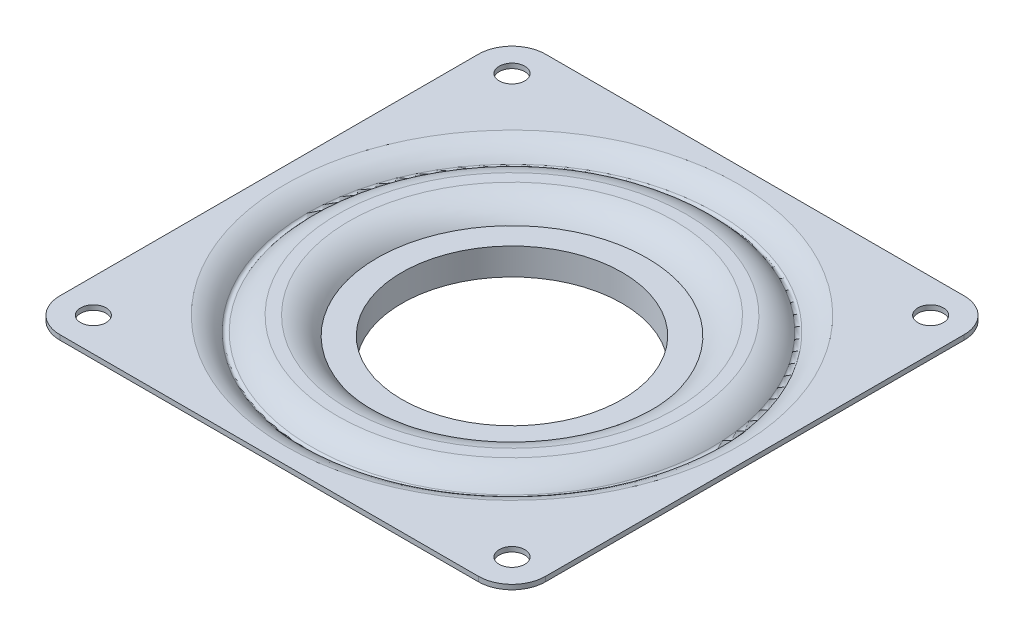
ISO-10303-21;
HEADER;
FILE_DESCRIPTION(('STEP AP214'),'2;1');
FILE_NAME('part.step','',(''),(''),'','','');
FILE_SCHEMA(('AUTOMOTIVE_DESIGN { 1 0 10303 214 1 1 1 1 }'));
ENDSEC;
DATA;
#1=APPLICATION_CONTEXT('core data for automotive mechanical design processes');
#2=APPLICATION_PROTOCOL_DEFINITION('international standard','automotive_design',2000,#1);
#3=PRODUCT_CONTEXT('',#1,'mechanical');
#4=PRODUCT('Part','Part','',(#3));
#5=PRODUCT_RELATED_PRODUCT_CATEGORY('part','',(#4));
#6=PRODUCT_DEFINITION_FORMATION('','',#4);
#7=PRODUCT_DEFINITION_CONTEXT('part definition',#1,'design');
#8=PRODUCT_DEFINITION('design','',#6,#7);
#9=PRODUCT_DEFINITION_SHAPE('','',#8);
#10=(LENGTH_UNIT() NAMED_UNIT(*) SI_UNIT(.MILLI.,.METRE.));
#11=(NAMED_UNIT(*) PLANE_ANGLE_UNIT() SI_UNIT($,.RADIAN.));
#12=(NAMED_UNIT(*) SI_UNIT($,.STERADIAN.) SOLID_ANGLE_UNIT());
#13=UNCERTAINTY_MEASURE_WITH_UNIT(LENGTH_MEASURE(1.E-05),#10,'distance_accuracy_value','');
#14=(GEOMETRIC_REPRESENTATION_CONTEXT(3) GLOBAL_UNCERTAINTY_ASSIGNED_CONTEXT((#13)) GLOBAL_UNIT_ASSIGNED_CONTEXT((#10,
#11,#12)) REPRESENTATION_CONTEXT('',''));
#15=CARTESIAN_POINT('',(0.,0.,0.));
#16=DIRECTION('',(0.,0.,1.));
#17=DIRECTION('',(1.,0.,0.));
#18=AXIS2_PLACEMENT_3D('',#15,#16,#17);
#19=CARTESIAN_POINT('',(0.,0.75,0.));
#20=DIRECTION('',(0.,0.,-1.));
#21=DIRECTION('',(-1.,0.,0.));
#22=AXIS2_PLACEMENT_3D('',#19,#20,#21);
#23=PLANE('',#22);
#24=DIRECTION('',(1.,0.,0.));
#25=VECTOR('',#24,1.);
#26=CARTESIAN_POINT('',(0.,0.,0.));
#27=LINE('',#26,#25);
#28=CARTESIAN_POINT('',(5.25,0.,0.));
#29=VERTEX_POINT('',#28);
#30=CARTESIAN_POINT('',(70.75,0.,0.));
#31=VERTEX_POINT('',#30);
#32=EDGE_CURVE('E159',#29,#31,#27,.T.);
#33=ORIENTED_EDGE('',*,*,#32,.T.);
#34=DIRECTION('',(0.,-1.,0.));
#35=VECTOR('',#34,1.);
#36=CARTESIAN_POINT('',(70.75,0.75,0.));
#37=LINE('',#36,#35);
#38=CARTESIAN_POINT('',(70.75,0.75,0.));
#39=VERTEX_POINT('',#38);
#40=EDGE_CURVE('E51',#39,#31,#37,.T.);
#41=ORIENTED_EDGE('',*,*,#40,.F.);
#42=DIRECTION('',(1.,0.,0.));
#43=VECTOR('',#42,1.);
#44=CARTESIAN_POINT('',(0.,0.75,0.));
#45=LINE('',#44,#43);
#46=CARTESIAN_POINT('',(5.25,0.75,0.));
#47=VERTEX_POINT('',#46);
#48=EDGE_CURVE('E229',#47,#39,#45,.T.);
#49=ORIENTED_EDGE('',*,*,#48,.F.);
#50=DIRECTION('',(0.,-1.,0.));
#51=VECTOR('',#50,1.);
#52=CARTESIAN_POINT('',(5.25,0.75,0.));
#53=LINE('',#52,#51);
#54=EDGE_CURVE('E138',#47,#29,#53,.T.);
#55=ORIENTED_EDGE('',*,*,#54,.T.);
#56=EDGE_LOOP('',(#33,#41,#49,#55));
#57=FACE_BOUND('',#56,.T.);
#58=ADVANCED_FACE('F41',(#57),#23,.F.);
#59=CARTESIAN_POINT('',(70.75,0.75,-5.25000000000001));
#60=DIRECTION('',(0.,-1.,0.));
#61=DIRECTION('',(0.,0.,-1.));
#62=AXIS2_PLACEMENT_3D('',#59,#60,#61);
#63=CYLINDRICAL_SURFACE('',#62,5.25);
#64=CARTESIAN_POINT('',(70.75,0.,-5.25000000000001));
#65=DIRECTION('',(0.,1.,0.));
#66=DIRECTION('',(0.,0.,1.));
#67=AXIS2_PLACEMENT_3D('',#64,#65,#66);
#68=CIRCLE('',#67,5.25);
#69=CARTESIAN_POINT('',(76.,0.,-5.25000000000001));
#70=VERTEX_POINT('',#69);
#71=EDGE_CURVE('E163',#31,#70,#68,.T.);
#72=ORIENTED_EDGE('',*,*,#71,.T.);
#73=DIRECTION('',(0.,-1.,0.));
#74=VECTOR('',#73,1.);
#75=CARTESIAN_POINT('',(76.,0.75,-5.25000000000001));
#76=LINE('',#75,#74);
#77=CARTESIAN_POINT('',(76.,0.75,-5.25000000000001));
#78=VERTEX_POINT('',#77);
#79=EDGE_CURVE('E198',#78,#70,#76,.T.);
#80=ORIENTED_EDGE('',*,*,#79,.F.);
#81=CARTESIAN_POINT('',(70.75,0.75,-5.25000000000001));
#82=DIRECTION('',(0.,1.,0.));
#83=DIRECTION('',(0.,0.,1.));
#84=AXIS2_PLACEMENT_3D('',#81,#82,#83);
#85=CIRCLE('',#84,5.25);
#86=EDGE_CURVE('E99',#39,#78,#85,.T.);
#87=ORIENTED_EDGE('',*,*,#86,.F.);
#88=ORIENTED_EDGE('',*,*,#40,.T.);
#89=EDGE_LOOP('',(#72,#80,#87,#88));
#90=FACE_BOUND('',#89,.T.);
#91=ADVANCED_FACE('F203',(#90),#63,.T.);
#92=CARTESIAN_POINT('',(76.,0.75,0.));
#93=DIRECTION('',(-1.,0.,0.));
#94=DIRECTION('',(0.,0.,1.));
#95=AXIS2_PLACEMENT_3D('',#92,#93,#94);
#96=PLANE('',#95);
#97=DIRECTION('',(0.,0.,-1.));
#98=VECTOR('',#97,1.);
#99=CARTESIAN_POINT('',(76.,0.,0.));
#100=LINE('',#99,#98);
#101=CARTESIAN_POINT('',(76.,0.,-70.75));
#102=VERTEX_POINT('',#101);
#103=EDGE_CURVE('E166',#70,#102,#100,.T.);
#104=ORIENTED_EDGE('',*,*,#103,.T.);
#105=DIRECTION('',(0.,-1.,0.));
#106=VECTOR('',#105,1.);
#107=CARTESIAN_POINT('',(76.,0.75,-70.75));
#108=LINE('',#107,#106);
#109=CARTESIAN_POINT('',(76.,0.75,-70.75));
#110=VERTEX_POINT('',#109);
#111=EDGE_CURVE('E194',#110,#102,#108,.T.);
#112=ORIENTED_EDGE('',*,*,#111,.F.);
#113=DIRECTION('',(0.,0.,-1.));
#114=VECTOR('',#113,1.);
#115=CARTESIAN_POINT('',(76.,0.75,0.));
#116=LINE('',#115,#114);
#117=EDGE_CURVE('E221',#78,#110,#116,.T.);
#118=ORIENTED_EDGE('',*,*,#117,.F.);
#119=ORIENTED_EDGE('',*,*,#79,.T.);
#120=EDGE_LOOP('',(#104,#112,#118,#119));
#121=FACE_BOUND('',#120,.T.);
#122=ADVANCED_FACE('F213',(#121),#96,.F.);
#123=CARTESIAN_POINT('',(70.75,0.75,-70.75));
#124=DIRECTION('',(0.,-1.,0.));
#125=DIRECTION('',(0.,0.,-1.));
#126=AXIS2_PLACEMENT_3D('',#123,#124,#125);
#127=CYLINDRICAL_SURFACE('',#126,5.25);
#128=CARTESIAN_POINT('',(70.75,0.,-70.75));
#129=DIRECTION('',(0.,1.,0.));
#130=DIRECTION('',(0.,0.,1.));
#131=AXIS2_PLACEMENT_3D('',#128,#129,#130);
#132=CIRCLE('',#131,5.25);
#133=CARTESIAN_POINT('',(70.75,0.,-76.));
#134=VERTEX_POINT('',#133);
#135=EDGE_CURVE('E169',#102,#134,#132,.T.);
#136=ORIENTED_EDGE('',*,*,#135,.T.);
#137=DIRECTION('',(0.,-1.,0.));
#138=VECTOR('',#137,1.);
#139=CARTESIAN_POINT('',(70.75,0.75,-76.));
#140=LINE('',#139,#138);
#141=CARTESIAN_POINT('',(70.75,0.75,-76.));
#142=VERTEX_POINT('',#141);
#143=EDGE_CURVE('E191',#142,#134,#140,.T.);
#144=ORIENTED_EDGE('',*,*,#143,.F.);
#145=CARTESIAN_POINT('',(70.75,0.75,-70.75));
#146=DIRECTION('',(0.,1.,0.));
#147=DIRECTION('',(0.,0.,1.));
#148=AXIS2_PLACEMENT_3D('',#145,#146,#147);
#149=CIRCLE('',#148,5.25);
#150=EDGE_CURVE('E219',#110,#142,#149,.T.);
#151=ORIENTED_EDGE('',*,*,#150,.F.);
#152=ORIENTED_EDGE('',*,*,#111,.T.);
#153=EDGE_LOOP('',(#136,#144,#151,#152));
#154=FACE_BOUND('',#153,.T.);
#155=ADVANCED_FACE('F217',(#154),#127,.T.);
#156=CARTESIAN_POINT('',(0.,0.75,-76.));
#157=DIRECTION('',(0.,0.,-1.));
#158=DIRECTION('',(-1.,0.,0.));
#159=AXIS2_PLACEMENT_3D('',#156,#157,#158);
#160=PLANE('',#159);
#161=DIRECTION('',(1.,0.,0.));
#162=VECTOR('',#161,1.);
#163=CARTESIAN_POINT('',(0.,0.,-76.));
#164=LINE('',#163,#162);
#165=CARTESIAN_POINT('',(5.25000000000001,0.,-76.));
#166=VERTEX_POINT('',#165);
#167=EDGE_CURVE('E173',#166,#134,#164,.T.);
#168=ORIENTED_EDGE('',*,*,#167,.F.);
#169=DIRECTION('',(0.,-1.,0.));
#170=VECTOR('',#169,1.);
#171=CARTESIAN_POINT('',(5.25000000000001,0.75,-76.));
#172=LINE('',#171,#170);
#173=CARTESIAN_POINT('',(5.25000000000001,0.75,-76.));
#174=VERTEX_POINT('',#173);
#175=EDGE_CURVE('E132',#174,#166,#172,.T.);
#176=ORIENTED_EDGE('',*,*,#175,.F.);
#177=DIRECTION('',(1.,0.,0.));
#178=VECTOR('',#177,1.);
#179=CARTESIAN_POINT('',(0.,0.75,-76.));
#180=LINE('',#179,#178);
#181=EDGE_CURVE('E119',#174,#142,#180,.T.);
#182=ORIENTED_EDGE('',*,*,#181,.T.);
#183=ORIENTED_EDGE('',*,*,#143,.T.);
#184=EDGE_LOOP('',(#168,#176,#182,#183));
#185=FACE_BOUND('',#184,.T.);
#186=ADVANCED_FACE('F383',(#185),#160,.T.);
#187=CARTESIAN_POINT('',(5.25000000000001,0.75,-70.75));
#188=DIRECTION('',(0.,-1.,0.));
#189=DIRECTION('',(0.,0.,-1.));
#190=AXIS2_PLACEMENT_3D('',#187,#188,#189);
#191=CYLINDRICAL_SURFACE('',#190,5.25000000000001);
#192=CARTESIAN_POINT('',(5.25000000000001,0.,-70.75));
#193=DIRECTION('',(0.,1.,0.));
#194=DIRECTION('',(0.,0.,1.));
#195=AXIS2_PLACEMENT_3D('',#192,#193,#194);
#196=CIRCLE('',#195,5.25000000000001);
#197=CARTESIAN_POINT('',(0.,0.,-70.75));
#198=VERTEX_POINT('',#197);
#199=EDGE_CURVE('E127',#166,#198,#196,.T.);
#200=ORIENTED_EDGE('',*,*,#199,.T.);
#201=DIRECTION('',(0.,-1.,0.));
#202=VECTOR('',#201,1.);
#203=CARTESIAN_POINT('',(0.,0.75,-70.75));
#204=LINE('',#203,#202);
#205=CARTESIAN_POINT('',(0.,0.75,-70.75));
#206=VERTEX_POINT('',#205);
#207=EDGE_CURVE('E124',#206,#198,#204,.T.);
#208=ORIENTED_EDGE('',*,*,#207,.F.);
#209=CARTESIAN_POINT('',(5.25000000000001,0.75,-70.75));
#210=DIRECTION('',(0.,1.,0.));
#211=DIRECTION('',(0.,0.,1.));
#212=AXIS2_PLACEMENT_3D('',#209,#210,#211);
#213=CIRCLE('',#212,5.25000000000001);
#214=EDGE_CURVE('E113',#174,#206,#213,.T.);
#215=ORIENTED_EDGE('',*,*,#214,.F.);
#216=ORIENTED_EDGE('',*,*,#175,.T.);
#217=EDGE_LOOP('',(#200,#208,#215,#216));
#218=FACE_BOUND('',#217,.T.);
#219=ADVANCED_FACE('F125',(#218),#191,.T.);
#220=CARTESIAN_POINT('',(0.,0.75,0.));
#221=DIRECTION('',(-1.,0.,0.));
#222=DIRECTION('',(0.,0.,1.));
#223=AXIS2_PLACEMENT_3D('',#220,#221,#222);
#224=PLANE('',#223);
#225=DIRECTION('',(0.,0.,-1.));
#226=VECTOR('',#225,1.);
#227=CARTESIAN_POINT('',(0.,0.,0.));
#228=LINE('',#227,#226);
#229=CARTESIAN_POINT('',(0.,0.,-5.25));
#230=VERTEX_POINT('',#229);
#231=EDGE_CURVE('E179',#230,#198,#228,.T.);
#232=ORIENTED_EDGE('',*,*,#231,.F.);
#233=DIRECTION('',(0.,-1.,0.));
#234=VECTOR('',#233,1.);
#235=CARTESIAN_POINT('',(0.,0.75,-5.25));
#236=LINE('',#235,#234);
#237=CARTESIAN_POINT('',(0.,0.75,-5.25));
#238=VERTEX_POINT('',#237);
#239=EDGE_CURVE('E87',#238,#230,#236,.T.);
#240=ORIENTED_EDGE('',*,*,#239,.F.);
#241=DIRECTION('',(0.,0.,-1.));
#242=VECTOR('',#241,1.);
#243=CARTESIAN_POINT('',(0.,0.75,0.));
#244=LINE('',#243,#242);
#245=EDGE_CURVE('E117',#238,#206,#244,.T.);
#246=ORIENTED_EDGE('',*,*,#245,.T.);
#247=ORIENTED_EDGE('',*,*,#207,.T.);
#248=EDGE_LOOP('',(#232,#240,#246,#247));
#249=FACE_BOUND('',#248,.T.);
#250=ADVANCED_FACE('F134',(#249),#224,.T.);
#251=CARTESIAN_POINT('',(5.25000000000001,0.75,-70.75));
#252=DIRECTION('',(0.,-1.,0.));
#253=DIRECTION('',(0.,0.,-1.));
#254=AXIS2_PLACEMENT_3D('',#251,#252,#253);
#255=CYLINDRICAL_SURFACE('',#254,2.);
#256=CARTESIAN_POINT('',(5.25000000000001,0.75,-70.75));
#257=DIRECTION('',(0.,1.,0.));
#258=DIRECTION('',(0.,0.,1.));
#259=AXIS2_PLACEMENT_3D('',#256,#257,#258);
#260=CIRCLE('',#259,2.);
#261=CARTESIAN_POINT('',(5.25000000000001,0.75,-68.75));
#262=VERTEX_POINT('',#261);
#263=EDGE_CURVE('E232',#262,#262,#260,.T.);
#264=ORIENTED_EDGE('',*,*,#263,.T.);
#265=EDGE_LOOP('',(#264));
#266=FACE_BOUND('',#265,.T.);
#267=CARTESIAN_POINT('',(5.25000000000001,0.,-70.75));
#268=DIRECTION('',(0.,1.,0.));
#269=DIRECTION('',(0.,0.,1.));
#270=AXIS2_PLACEMENT_3D('',#267,#268,#269);
#271=CIRCLE('',#270,2.);
#272=CARTESIAN_POINT('',(5.25000000000001,0.,-68.75));
#273=VERTEX_POINT('',#272);
#274=EDGE_CURVE('E155',#273,#273,#271,.T.);
#275=ORIENTED_EDGE('',*,*,#274,.F.);
#276=EDGE_LOOP('',(#275));
#277=FACE_BOUND('',#276,.T.);
#278=ADVANCED_FACE('F335',(#266,#277),#255,.F.);
#279=CARTESIAN_POINT('',(70.75,0.75,-70.75));
#280=DIRECTION('',(0.,-1.,0.));
#281=DIRECTION('',(0.,0.,-1.));
#282=AXIS2_PLACEMENT_3D('',#279,#280,#281);
#283=CYLINDRICAL_SURFACE('',#282,2.);
#284=CARTESIAN_POINT('',(70.75,0.75,-70.75));
#285=DIRECTION('',(0.,1.,0.));
#286=DIRECTION('',(0.,0.,1.));
#287=AXIS2_PLACEMENT_3D('',#284,#285,#286);
#288=CIRCLE('',#287,2.);
#289=CARTESIAN_POINT('',(70.75,0.75,-68.75));
#290=VERTEX_POINT('',#289);
#291=EDGE_CURVE('E236',#290,#290,#288,.T.);
#292=ORIENTED_EDGE('',*,*,#291,.T.);
#293=EDGE_LOOP('',(#292));
#294=FACE_BOUND('',#293,.T.);
#295=CARTESIAN_POINT('',(70.75,0.,-70.75));
#296=DIRECTION('',(0.,1.,0.));
#297=DIRECTION('',(0.,0.,1.));
#298=AXIS2_PLACEMENT_3D('',#295,#296,#297);
#299=CIRCLE('',#298,2.);
#300=CARTESIAN_POINT('',(70.75,0.,-68.75));
#301=VERTEX_POINT('',#300);
#302=EDGE_CURVE('E151',#301,#301,#299,.T.);
#303=ORIENTED_EDGE('',*,*,#302,.F.);
#304=EDGE_LOOP('',(#303));
#305=FACE_BOUND('',#304,.T.);
#306=ADVANCED_FACE('F338',(#294,#305),#283,.F.);
#307=CARTESIAN_POINT('',(70.75,0.75,-5.25000000000001));
#308=DIRECTION('',(0.,-1.,0.));
#309=DIRECTION('',(0.,0.,-1.));
#310=AXIS2_PLACEMENT_3D('',#307,#308,#309);
#311=CYLINDRICAL_SURFACE('',#310,2.);
#312=CARTESIAN_POINT('',(70.75,0.75,-5.25000000000001));
#313=DIRECTION('',(0.,1.,0.));
#314=DIRECTION('',(0.,0.,1.));
#315=AXIS2_PLACEMENT_3D('',#312,#313,#314);
#316=CIRCLE('',#315,2.);
#317=CARTESIAN_POINT('',(70.75,0.75,-3.25000000000001));
#318=VERTEX_POINT('',#317);
#319=EDGE_CURVE('E240',#318,#318,#316,.T.);
#320=ORIENTED_EDGE('',*,*,#319,.T.);
#321=EDGE_LOOP('',(#320));
#322=FACE_BOUND('',#321,.T.);
#323=CARTESIAN_POINT('',(70.75,0.,-5.25000000000001));
#324=DIRECTION('',(0.,1.,0.));
#325=DIRECTION('',(0.,0.,1.));
#326=AXIS2_PLACEMENT_3D('',#323,#324,#325);
#327=CIRCLE('',#326,2.);
#328=CARTESIAN_POINT('',(70.75,0.,-3.25000000000001));
#329=VERTEX_POINT('',#328);
#330=EDGE_CURVE('E146',#329,#329,#327,.T.);
#331=ORIENTED_EDGE('',*,*,#330,.F.);
#332=EDGE_LOOP('',(#331));
#333=FACE_BOUND('',#332,.T.);
#334=ADVANCED_FACE('F341',(#322,#333),#311,.F.);
#335=CARTESIAN_POINT('',(5.25,0.75,-5.25));
#336=DIRECTION('',(0.,-1.,0.));
#337=DIRECTION('',(0.,0.,-1.));
#338=AXIS2_PLACEMENT_3D('',#335,#336,#337);
#339=CYLINDRICAL_SURFACE('',#338,2.);
#340=CARTESIAN_POINT('',(5.25,0.75,-5.25));
#341=DIRECTION('',(0.,1.,0.));
#342=DIRECTION('',(0.,0.,1.));
#343=AXIS2_PLACEMENT_3D('',#340,#341,#342);
#344=CIRCLE('',#343,2.);
#345=CARTESIAN_POINT('',(5.25,0.75,-3.25));
#346=VERTEX_POINT('',#345);
#347=EDGE_CURVE('E184',#346,#346,#344,.T.);
#348=ORIENTED_EDGE('',*,*,#347,.T.);
#349=EDGE_LOOP('',(#348));
#350=FACE_BOUND('',#349,.T.);
#351=CARTESIAN_POINT('',(5.25,0.,-5.25));
#352=DIRECTION('',(0.,1.,0.));
#353=DIRECTION('',(0.,0.,1.));
#354=AXIS2_PLACEMENT_3D('',#351,#352,#353);
#355=CIRCLE('',#354,2.);
#356=CARTESIAN_POINT('',(5.25,0.,-3.25));
#357=VERTEX_POINT('',#356);
#358=EDGE_CURVE('E142',#357,#357,#355,.T.);
#359=ORIENTED_EDGE('',*,*,#358,.F.);
#360=EDGE_LOOP('',(#359));
#361=FACE_BOUND('',#360,.T.);
#362=ADVANCED_FACE('F43',(#350,#361),#339,.F.);
#363=CARTESIAN_POINT('',(5.25,0.75,-5.25));
#364=DIRECTION('',(0.,-1.,0.));
#365=DIRECTION('',(0.,0.,-1.));
#366=AXIS2_PLACEMENT_3D('',#363,#364,#365);
#367=CYLINDRICAL_SURFACE('',#366,5.25);
#368=CARTESIAN_POINT('',(5.25,0.,-5.25));
#369=DIRECTION('',(0.,1.,0.));
#370=DIRECTION('',(0.,0.,1.));
#371=AXIS2_PLACEMENT_3D('',#368,#369,#370);
#372=CIRCLE('',#371,5.25);
#373=EDGE_CURVE('E90',#230,#29,#372,.T.);
#374=ORIENTED_EDGE('',*,*,#373,.T.);
#375=ORIENTED_EDGE('',*,*,#54,.F.);
#376=CARTESIAN_POINT('',(5.25,0.75,-5.25));
#377=DIRECTION('',(0.,1.,0.));
#378=DIRECTION('',(0.,0.,1.));
#379=AXIS2_PLACEMENT_3D('',#376,#377,#378);
#380=CIRCLE('',#379,5.25);
#381=EDGE_CURVE('E59',#238,#47,#380,.T.);
#382=ORIENTED_EDGE('',*,*,#381,.F.);
#383=ORIENTED_EDGE('',*,*,#239,.T.);
#384=EDGE_LOOP('',(#374,#375,#382,#383));
#385=FACE_BOUND('',#384,.T.);
#386=ADVANCED_FACE('F348',(#385),#367,.T.);
#387=CARTESIAN_POINT('',(0.,0.75,0.));
#388=DIRECTION('',(0.,1.,0.));
#389=DIRECTION('',(0.,0.,1.));
#390=AXIS2_PLACEMENT_3D('',#387,#388,#389);
#391=PLANE('',#390);
#392=CARTESIAN_POINT('',(38.,0.75,-38.));
#393=DIRECTION('',(0.,1.,0.));
#394=DIRECTION('',(0.,0.,1.));
#395=AXIS2_PLACEMENT_3D('',#392,#393,#394);
#396=CIRCLE('',#395,35.4822469729916);
#397=CARTESIAN_POINT('',(38.,0.75,-2.5177530270084));
#398=VERTEX_POINT('',#397);
#399=EDGE_CURVE('E147',#398,#398,#396,.T.);
#400=ORIENTED_EDGE('',*,*,#399,.F.);
#401=EDGE_LOOP('',(#400));
#402=FACE_BOUND('',#401,.T.);
#403=ORIENTED_EDGE('',*,*,#347,.F.);
#404=EDGE_LOOP('',(#403));
#405=FACE_BOUND('',#404,.T.);
#406=ORIENTED_EDGE('',*,*,#319,.F.);
#407=EDGE_LOOP('',(#406));
#408=FACE_BOUND('',#407,.T.);
#409=ORIENTED_EDGE('',*,*,#291,.F.);
#410=EDGE_LOOP('',(#409));
#411=FACE_BOUND('',#410,.T.);
#412=ORIENTED_EDGE('',*,*,#263,.F.);
#413=EDGE_LOOP('',(#412));
#414=FACE_BOUND('',#413,.T.);
#415=ORIENTED_EDGE('',*,*,#48,.T.);
#416=ORIENTED_EDGE('',*,*,#86,.T.);
#417=ORIENTED_EDGE('',*,*,#117,.T.);
#418=ORIENTED_EDGE('',*,*,#150,.T.);
#419=ORIENTED_EDGE('',*,*,#181,.F.);
#420=ORIENTED_EDGE('',*,*,#214,.T.);
#421=ORIENTED_EDGE('',*,*,#245,.F.);
#422=ORIENTED_EDGE('',*,*,#381,.T.);
#423=EDGE_LOOP('',(#415,#416,#417,#418,#419,#420,#421,#422));
#424=FACE_BOUND('',#423,.T.);
#425=ADVANCED_FACE('F115',(#402,#405,#408,#411,#414,#424),#391,.T.);
#426=CARTESIAN_POINT('',(0.,0.,0.));
#427=DIRECTION('',(0.,1.,0.));
#428=DIRECTION('',(0.,0.,1.));
#429=AXIS2_PLACEMENT_3D('',#426,#427,#428);
#430=PLANE('',#429);
#431=CARTESIAN_POINT('',(38.,0.,-38.));
#432=DIRECTION('',(0.,-1.,0.));
#433=DIRECTION('',(0.,0.,-1.));
#434=AXIS2_PLACEMENT_3D('',#431,#432,#433);
#435=CIRCLE('',#434,35.5653053012916);
#436=CARTESIAN_POINT('',(38.,0.,-73.5653053012916));
#437=VERTEX_POINT('',#436);
#438=EDGE_CURVE('E11',#437,#437,#435,.T.);
#439=ORIENTED_EDGE('',*,*,#438,.F.);
#440=EDGE_LOOP('',(#439));
#441=FACE_BOUND('',#440,.T.);
#442=ORIENTED_EDGE('',*,*,#358,.T.);
#443=EDGE_LOOP('',(#442));
#444=FACE_BOUND('',#443,.T.);
#445=ORIENTED_EDGE('',*,*,#330,.T.);
#446=EDGE_LOOP('',(#445));
#447=FACE_BOUND('',#446,.T.);
#448=ORIENTED_EDGE('',*,*,#302,.T.);
#449=EDGE_LOOP('',(#448));
#450=FACE_BOUND('',#449,.T.);
#451=ORIENTED_EDGE('',*,*,#274,.T.);
#452=EDGE_LOOP('',(#451));
#453=FACE_BOUND('',#452,.T.);
#454=ORIENTED_EDGE('',*,*,#32,.F.);
#455=ORIENTED_EDGE('',*,*,#373,.F.);
#456=ORIENTED_EDGE('',*,*,#231,.T.);
#457=ORIENTED_EDGE('',*,*,#199,.F.);
#458=ORIENTED_EDGE('',*,*,#167,.T.);
#459=ORIENTED_EDGE('',*,*,#135,.F.);
#460=ORIENTED_EDGE('',*,*,#103,.F.);
#461=ORIENTED_EDGE('',*,*,#71,.F.);
#462=EDGE_LOOP('',(#454,#455,#456,#457,#458,#459,#460,#461));
#463=FACE_BOUND('',#462,.T.);
#464=ADVANCED_FACE('F208',(#441,#444,#447,#450,#453,#463),#430,.F.);
#465=CARTESIAN_POINT('',(38.,-4.83748772009786,-38.));
#466=DIRECTION('',(0.,-1.,0.));
#467=DIRECTION('',(0.,0.,-1.));
#468=AXIS2_PLACEMENT_3D('',#465,#466,#467);
#469=TOROIDAL_SURFACE('',#468,36.6911234864958,4.96676494594158);
#470=CARTESIAN_POINT('',(38.,-1.90634873338465,-38.));
#471=DIRECTION('',(0.,-1.,0.));
#472=DIRECTION('',(0.,0.,-1.));
#473=AXIS2_PLACEMENT_3D('',#470,#471,#472);
#474=CIRCLE('',#473,32.6814878086812);
#475=CARTESIAN_POINT('',(38.,-1.90634873338465,-70.6814878086812));
#476=VERTEX_POINT('',#475);
#477=EDGE_CURVE('E278',#476,#476,#474,.T.);
#478=ORIENTED_EDGE('',*,*,#477,.F.);
#479=EDGE_LOOP('',(#478));
#480=FACE_BOUND('',#479,.T.);
#481=ORIENTED_EDGE('',*,*,#438,.T.);
#482=EDGE_LOOP('',(#481));
#483=FACE_BOUND('',#482,.T.);
#484=ADVANCED_FACE('F356',(#480,#483),#469,.F.);
#485=CARTESIAN_POINT('',(38.,-5.49928571428572,-38.));
#486=DIRECTION('',(0.,-1.,0.));
#487=DIRECTION('',(0.,0.,-1.));
#488=AXIS2_PLACEMENT_3D('',#485,#486,#487);
#489=TOROIDAL_SURFACE('',#488,26.41,5.5651937372321);
#490=CARTESIAN_POINT('',(38.,-1.96295661115603,-38.));
#491=DIRECTION('',(0.,-1.,0.));
#492=DIRECTION('',(0.,0.,-1.));
#493=AXIS2_PLACEMENT_3D('',#490,#491,#492);
#494=CIRCLE('',#493,30.7071802158259);
#495=CARTESIAN_POINT('',(38.,-1.96295661115603,-68.7071802158259));
#496=VERTEX_POINT('',#495);
#497=EDGE_CURVE('E282',#496,#496,#494,.T.);
#498=ORIENTED_EDGE('',*,*,#497,.T.);
#499=EDGE_LOOP('',(#498));
#500=FACE_BOUND('',#499,.T.);
#501=CARTESIAN_POINT('',(38.,-2.79999999999999,-38.));
#502=DIRECTION('',(0.,-1.,0.));
#503=DIRECTION('',(0.,0.,-1.));
#504=AXIS2_PLACEMENT_3D('',#501,#502,#503);
#505=CIRCLE('',#504,21.5432518078721);
#506=CARTESIAN_POINT('',(38.,-2.79999999999999,-59.5432518078721));
#507=VERTEX_POINT('',#506);
#508=EDGE_CURVE('E250',#507,#507,#505,.T.);
#509=ORIENTED_EDGE('',*,*,#508,.F.);
#510=EDGE_LOOP('',(#509));
#511=FACE_BOUND('',#510,.T.);
#512=ADVANCED_FACE('F368',(#500,#511),#489,.F.);
#513=CARTESIAN_POINT('',(0.,-2.79999999999999,-38.));
#514=DIRECTION('',(0.,-1.,0.));
#515=DIRECTION('',(0.,0.,-1.));
#516=AXIS2_PLACEMENT_3D('',#513,#514,#515);
#517=PLANE('',#516);
#518=ORIENTED_EDGE('',*,*,#508,.T.);
#519=EDGE_LOOP('',(#518));
#520=FACE_BOUND('',#519,.T.);
#521=CARTESIAN_POINT('',(38.,-2.79999999999999,-38.));
#522=DIRECTION('',(0.,-1.,0.));
#523=DIRECTION('',(0.,0.,-1.));
#524=AXIS2_PLACEMENT_3D('',#521,#522,#523);
#525=CIRCLE('',#524,17.98);
#526=CARTESIAN_POINT('',(38.,-2.79999999999999,-55.98));
#527=VERTEX_POINT('',#526);
#528=EDGE_CURVE('E254',#527,#527,#525,.T.);
#529=ORIENTED_EDGE('',*,*,#528,.F.);
#530=EDGE_LOOP('',(#529));
#531=FACE_BOUND('',#530,.T.);
#532=ADVANCED_FACE('F458',(#520,#531),#517,.T.);
#533=CARTESIAN_POINT('',(0.,-2.04999999999999,-38.));
#534=DIRECTION('',(0.,-1.,0.));
#535=DIRECTION('',(0.,0.,-1.));
#536=AXIS2_PLACEMENT_3D('',#533,#534,#535);
#537=PLANE('',#536);
#538=CARTESIAN_POINT('',(38.,-2.04999999999999,-38.));
#539=DIRECTION('',(0.,-1.,0.));
#540=DIRECTION('',(0.,0.,-1.));
#541=AXIS2_PLACEMENT_3D('',#538,#539,#540);
#542=CIRCLE('',#541,21.12);
#543=CARTESIAN_POINT('',(38.,-2.04999999999999,-59.12));
#544=VERTEX_POINT('',#543);
#545=EDGE_CURVE('E258',#544,#544,#542,.T.);
#546=ORIENTED_EDGE('',*,*,#545,.F.);
#547=EDGE_LOOP('',(#546));
#548=FACE_BOUND('',#547,.T.);
#549=CARTESIAN_POINT('',(38.,-2.04999999999999,-38.));
#550=DIRECTION('',(0.,-1.,0.));
#551=DIRECTION('',(0.,0.,-1.));
#552=AXIS2_PLACEMENT_3D('',#549,#550,#551);
#553=CIRCLE('',#552,17.23);
#554=CARTESIAN_POINT('',(38.,-2.04999999999999,-55.23));
#555=VERTEX_POINT('',#554);
#556=EDGE_CURVE('E294',#555,#555,#553,.T.);
#557=ORIENTED_EDGE('',*,*,#556,.T.);
#558=EDGE_LOOP('',(#557));
#559=FACE_BOUND('',#558,.T.);
#560=ADVANCED_FACE('F467',(#548,#559),#537,.F.);
#561=CARTESIAN_POINT('',(38.,-5.49928571428572,-38.));
#562=DIRECTION('',(0.,-1.,0.));
#563=DIRECTION('',(0.,0.,-1.));
#564=AXIS2_PLACEMENT_3D('',#561,#562,#563);
#565=TOROIDAL_SURFACE('',#564,26.41,6.3151937372321);
#566=CARTESIAN_POINT('',(38.,0.75,-38.));
#567=DIRECTION('',(0.,-1.,0.));
#568=DIRECTION('',(0.,0.,-1.));
#569=AXIS2_PLACEMENT_3D('',#566,#567,#568);
#570=CIRCLE('',#569,25.5);
#571=CARTESIAN_POINT('',(38.,0.75,-63.5));
#572=VERTEX_POINT('',#571);
#573=EDGE_CURVE('E262',#572,#572,#570,.T.);
#574=ORIENTED_EDGE('',*,*,#573,.F.);
#575=EDGE_LOOP('',(#574));
#576=FACE_BOUND('',#575,.T.);
#577=ORIENTED_EDGE('',*,*,#545,.T.);
#578=EDGE_LOOP('',(#577));
#579=FACE_BOUND('',#578,.T.);
#580=ADVANCED_FACE('F475',(#576,#579),#565,.T.);
#581=CARTESIAN_POINT('',(0.,0.75,-38.));
#582=DIRECTION('',(0.,1.,0.));
#583=DIRECTION('',(0.,0.,1.));
#584=AXIS2_PLACEMENT_3D('',#581,#582,#583);
#585=PLANE('',#584);
#586=ORIENTED_EDGE('',*,*,#573,.T.);
#587=EDGE_LOOP('',(#586));
#588=FACE_BOUND('',#587,.T.);
#589=CARTESIAN_POINT('',(38.,0.75,-38.));
#590=DIRECTION('',(0.,-1.,0.));
#591=DIRECTION('',(0.,0.,-1.));
#592=AXIS2_PLACEMENT_3D('',#589,#590,#591);
#593=CIRCLE('',#592,27.32);
#594=CARTESIAN_POINT('',(38.,0.75,-65.32));
#595=VERTEX_POINT('',#594);
#596=EDGE_CURVE('E266',#595,#595,#593,.T.);
#597=ORIENTED_EDGE('',*,*,#596,.F.);
#598=EDGE_LOOP('',(#597));
#599=FACE_BOUND('',#598,.T.);
#600=ADVANCED_FACE('F480',(#588,#599),#585,.T.);
#601=CARTESIAN_POINT('',(38.,-1.48637898374959,-38.));
#602=DIRECTION('',(0.,-1.,0.));
#603=DIRECTION('',(0.,0.,-1.));
#604=AXIS2_PLACEMENT_3D('',#601,#602,#603);
#605=CIRCLE('',#604,31.286294854784);
#606=CARTESIAN_POINT('',(38.,-1.48637898374959,-69.286294854784));
#607=VERTEX_POINT('',#606);
#608=EDGE_CURVE('E270',#607,#607,#605,.T.);
#609=ORIENTED_EDGE('',*,*,#608,.F.);
#610=EDGE_LOOP('',(#609));
#611=FACE_BOUND('',#610,.T.);
#612=ORIENTED_EDGE('',*,*,#596,.T.);
#613=EDGE_LOOP('',(#612));
#614=FACE_BOUND('',#613,.T.);
#615=ADVANCED_FACE('F483',(#611,#614),#565,.T.);
#616=CARTESIAN_POINT('',(38.,-1.16866056547863,-38.));
#617=DIRECTION('',(0.,-1.,0.));
#618=DIRECTION('',(0.,0.,-1.));
#619=AXIS2_PLACEMENT_3D('',#616,#617,#618);
#620=TOROIDAL_SURFACE('',#619,31.6723712807562,0.5);
#621=ORIENTED_EDGE('',*,*,#608,.T.);
#622=EDGE_LOOP('',(#621));
#623=FACE_BOUND('',#622,.T.);
#624=CARTESIAN_POINT('',(38.,-1.46373583264104,-38.));
#625=DIRECTION('',(0.,-1.,0.));
#626=DIRECTION('',(0.,0.,-1.));
#627=AXIS2_PLACEMENT_3D('',#624,#625,#626);
#628=CIRCLE('',#627,32.0760178919262);
#629=CARTESIAN_POINT('',(38.,-1.46373583264104,-70.0760178919262));
#630=VERTEX_POINT('',#629);
#631=EDGE_CURVE('E274',#630,#630,#628,.T.);
#632=ORIENTED_EDGE('',*,*,#631,.F.);
#633=EDGE_LOOP('',(#632));
#634=FACE_BOUND('',#633,.T.);
#635=ADVANCED_FACE('F500',(#623,#634),#620,.F.);
#636=CARTESIAN_POINT('',(38.,-4.83748772009786,-38.));
#637=DIRECTION('',(0.,-1.,0.));
#638=DIRECTION('',(0.,0.,-1.));
#639=AXIS2_PLACEMENT_3D('',#636,#637,#638);
#640=TOROIDAL_SURFACE('',#639,36.6911234864958,5.71676494594158);
#641=ORIENTED_EDGE('',*,*,#631,.T.);
#642=EDGE_LOOP('',(#641));
#643=FACE_BOUND('',#642,.T.);
#644=ORIENTED_EDGE('',*,*,#399,.T.);
#645=EDGE_LOOP('',(#644));
#646=FACE_BOUND('',#645,.T.);
#647=ADVANCED_FACE('F509',(#643,#646),#640,.T.);
#648=CARTESIAN_POINT('',(38.,-1.16866056547863,-38.));
#649=DIRECTION('',(0.,-1.,0.));
#650=DIRECTION('',(0.,0.,-1.));
#651=AXIS2_PLACEMENT_3D('',#648,#649,#650);
#652=TOROIDAL_SURFACE('',#651,31.6723712807562,1.25);
#653=ORIENTED_EDGE('',*,*,#497,.F.);
#654=EDGE_LOOP('',(#653));
#655=FACE_BOUND('',#654,.T.);
#656=ORIENTED_EDGE('',*,*,#477,.T.);
#657=EDGE_LOOP('',(#656));
#658=FACE_BOUND('',#657,.T.);
#659=ADVANCED_FACE('F519',(#655,#658),#652,.T.);
#660=CARTESIAN_POINT('',(38.,0.,-38.));
#661=DIRECTION('',(0.,-1.,0.));
#662=DIRECTION('',(0.,0.,-1.));
#663=AXIS2_PLACEMENT_3D('',#660,#661,#662);
#664=CYLINDRICAL_SURFACE('',#663,19.23);
#665=CARTESIAN_POINT('',(38.,-5.5,-38.));
#666=DIRECTION('',(0.,-1.,0.));
#667=DIRECTION('',(0.,0.,-1.));
#668=AXIS2_PLACEMENT_3D('',#665,#666,#667);
#669=CIRCLE('',#668,19.23);
#670=CARTESIAN_POINT('',(38.,-5.5,-57.23));
#671=VERTEX_POINT('',#670);
#672=EDGE_CURVE('E302',#671,#671,#669,.T.);
#673=ORIENTED_EDGE('',*,*,#672,.T.);
#674=EDGE_LOOP('',(#673));
#675=FACE_BOUND('',#674,.T.);
#676=CARTESIAN_POINT('',(38.,-6.25,-38.));
#677=DIRECTION('',(0.,-1.,0.));
#678=DIRECTION('',(0.,0.,-1.));
#679=AXIS2_PLACEMENT_3D('',#676,#677,#678);
#680=CIRCLE('',#679,19.23);
#681=CARTESIAN_POINT('',(38.,-6.25,-57.23));
#682=VERTEX_POINT('',#681);
#683=EDGE_CURVE('E286',#682,#682,#680,.T.);
#684=ORIENTED_EDGE('',*,*,#683,.F.);
#685=EDGE_LOOP('',(#684));
#686=FACE_BOUND('',#685,.T.);
#687=ADVANCED_FACE('F307',(#675,#686),#664,.T.);
#688=CARTESIAN_POINT('',(0.,-6.25,-38.));
#689=DIRECTION('',(0.,-1.,0.));
#690=DIRECTION('',(0.,0.,-1.));
#691=AXIS2_PLACEMENT_3D('',#688,#689,#690);
#692=PLANE('',#691);
#693=ORIENTED_EDGE('',*,*,#683,.T.);
#694=EDGE_LOOP('',(#693));
#695=FACE_BOUND('',#694,.T.);
#696=CARTESIAN_POINT('',(38.,-6.24999999999999,-38.));
#697=DIRECTION('',(0.,-1.,0.));
#698=DIRECTION('',(0.,0.,-1.));
#699=AXIS2_PLACEMENT_3D('',#696,#697,#698);
#700=CIRCLE('',#699,17.23);
#701=CARTESIAN_POINT('',(38.,-6.24999999999999,-55.23));
#702=VERTEX_POINT('',#701);
#703=EDGE_CURVE('E290',#702,#702,#700,.T.);
#704=ORIENTED_EDGE('',*,*,#703,.F.);
#705=EDGE_LOOP('',(#704));
#706=FACE_BOUND('',#705,.T.);
#707=ADVANCED_FACE('F324',(#695,#706),#692,.T.);
#708=CARTESIAN_POINT('',(38.,0.,-38.));
#709=DIRECTION('',(0.,-1.,0.));
#710=DIRECTION('',(0.,0.,-1.));
#711=AXIS2_PLACEMENT_3D('',#708,#709,#710);
#712=CYLINDRICAL_SURFACE('',#711,17.23);
#713=ORIENTED_EDGE('',*,*,#703,.T.);
#714=EDGE_LOOP('',(#713));
#715=FACE_BOUND('',#714,.T.);
#716=ORIENTED_EDGE('',*,*,#556,.F.);
#717=EDGE_LOOP('',(#716));
#718=FACE_BOUND('',#717,.T.);
#719=ADVANCED_FACE('F318',(#715,#718),#712,.F.);
#720=CARTESIAN_POINT('',(38.,0.,-38.));
#721=DIRECTION('',(0.,-1.,0.));
#722=DIRECTION('',(0.,0.,-1.));
#723=AXIS2_PLACEMENT_3D('',#720,#721,#722);
#724=CYLINDRICAL_SURFACE('',#723,17.98);
#725=ORIENTED_EDGE('',*,*,#528,.T.);
#726=EDGE_LOOP('',(#725));
#727=FACE_BOUND('',#726,.T.);
#728=CARTESIAN_POINT('',(38.,-5.5,-38.));
#729=DIRECTION('',(0.,-1.,0.));
#730=DIRECTION('',(0.,0.,-1.));
#731=AXIS2_PLACEMENT_3D('',#728,#729,#730);
#732=CIRCLE('',#731,17.98);
#733=CARTESIAN_POINT('',(38.,-5.5,-55.98));
#734=VERTEX_POINT('',#733);
#735=EDGE_CURVE('E298',#734,#734,#732,.T.);
#736=ORIENTED_EDGE('',*,*,#735,.F.);
#737=EDGE_LOOP('',(#736));
#738=FACE_BOUND('',#737,.T.);
#739=ADVANCED_FACE('F313',(#727,#738),#724,.T.);
#740=CARTESIAN_POINT('',(0.,-5.5,-38.));
#741=DIRECTION('',(0.,-1.,0.));
#742=DIRECTION('',(0.,0.,-1.));
#743=AXIS2_PLACEMENT_3D('',#740,#741,#742);
#744=PLANE('',#743);
#745=ORIENTED_EDGE('',*,*,#672,.F.);
#746=EDGE_LOOP('',(#745));
#747=FACE_BOUND('',#746,.T.);
#748=ORIENTED_EDGE('',*,*,#735,.T.);
#749=EDGE_LOOP('',(#748));
#750=FACE_BOUND('',#749,.T.);
#751=ADVANCED_FACE('F310',(#747,#750),#744,.F.);
#752=CLOSED_SHELL('',(#58,#91,#122,#155,#186,#219,#250,#278,#306,#334,#362,#386,#425,#464,#484,
#512,#532,#560,#580,#600,#615,#635,#647,#659,#687,#707,#719,#739,#751));
#753=MANIFOLD_SOLID_BREP('B2',#752);
#754=ADVANCED_BREP_SHAPE_REPRESENTATION('',(#18,#753),#14);
#755=SHAPE_DEFINITION_REPRESENTATION(#9,#754);
ENDSEC;
END-ISO-10303-21;
